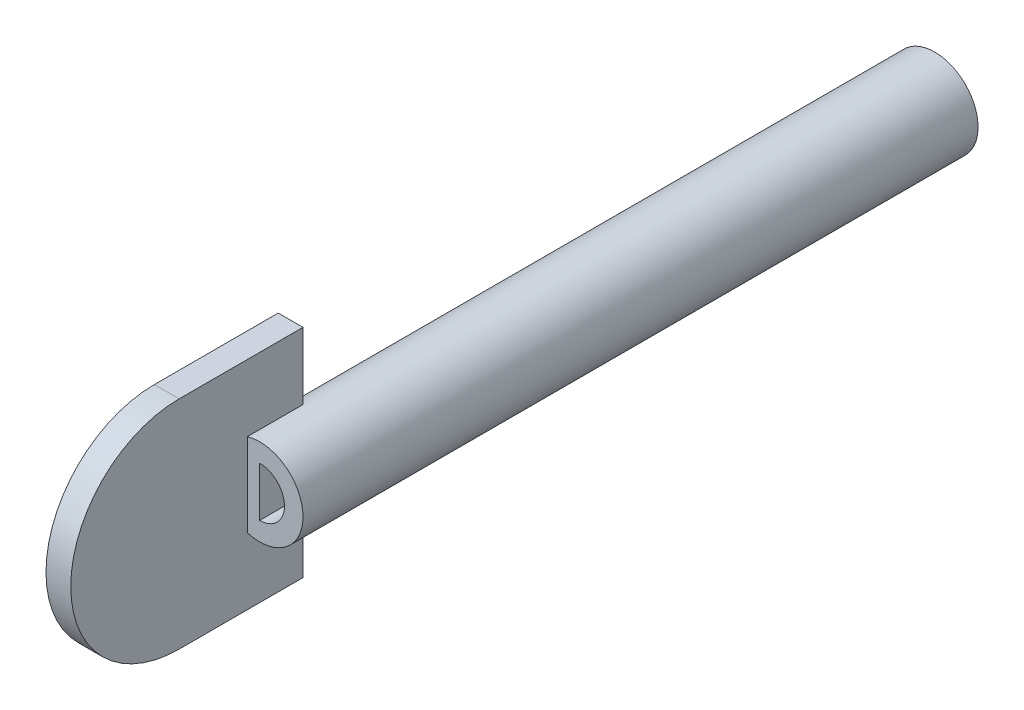
ISO-10303-21;
HEADER;
FILE_DESCRIPTION(('STEP AP214'),'2;1');
FILE_NAME('part.step','',(''),(''),'','','');
FILE_SCHEMA(('AUTOMOTIVE_DESIGN { 1 0 10303 214 1 1 1 1 }'));
ENDSEC;
DATA;
#1=APPLICATION_CONTEXT('core data for automotive mechanical design processes');
#2=APPLICATION_PROTOCOL_DEFINITION('international standard','automotive_design',2000,#1);
#3=PRODUCT_CONTEXT('',#1,'mechanical');
#4=PRODUCT('Part','Part','',(#3));
#5=PRODUCT_RELATED_PRODUCT_CATEGORY('part','',(#4));
#6=PRODUCT_DEFINITION_FORMATION('','',#4);
#7=PRODUCT_DEFINITION_CONTEXT('part definition',#1,'design');
#8=PRODUCT_DEFINITION('design','',#6,#7);
#9=PRODUCT_DEFINITION_SHAPE('','',#8);
#10=(LENGTH_UNIT() NAMED_UNIT(*) SI_UNIT(.MILLI.,.METRE.));
#11=(NAMED_UNIT(*) PLANE_ANGLE_UNIT() SI_UNIT($,.RADIAN.));
#12=(NAMED_UNIT(*) SI_UNIT($,.STERADIAN.) SOLID_ANGLE_UNIT());
#13=UNCERTAINTY_MEASURE_WITH_UNIT(LENGTH_MEASURE(1.E-05),#10,'distance_accuracy_value','');
#14=(GEOMETRIC_REPRESENTATION_CONTEXT(3) GLOBAL_UNCERTAINTY_ASSIGNED_CONTEXT((#13)) GLOBAL_UNIT_ASSIGNED_CONTEXT((#10,
#11,#12)) REPRESENTATION_CONTEXT('',''));
#15=CARTESIAN_POINT('',(0.,0.,0.));
#16=DIRECTION('',(0.,0.,1.));
#17=DIRECTION('',(1.,0.,0.));
#18=AXIS2_PLACEMENT_3D('',#15,#16,#17);
#19=CARTESIAN_POINT('',(4.,17.5,-20.));
#20=DIRECTION('',(0.,0.,1.));
#21=DIRECTION('',(1.,0.,0.));
#22=AXIS2_PLACEMENT_3D('',#19,#20,#21);
#23=PLANE('',#22);
#24=DIRECTION('',(0.,1.,0.));
#25=VECTOR('',#24,1.);
#26=CARTESIAN_POINT('',(4.,17.5,-20.));
#27=LINE('',#26,#25);
#28=CARTESIAN_POINT('',(4.,6.70820393249937,-20.));
#29=VERTEX_POINT('',#28);
#30=CARTESIAN_POINT('',(4.,17.5,-20.));
#31=VERTEX_POINT('',#30);
#32=EDGE_CURVE('E175',#29,#31,#27,.T.);
#33=ORIENTED_EDGE('',*,*,#32,.F.);
#34=CARTESIAN_POINT('',(6.,0.,-20.));
#35=DIRECTION('',(0.,0.,1.));
#36=DIRECTION('',(1.,0.,0.));
#37=AXIS2_PLACEMENT_3D('',#34,#35,#36);
#38=CIRCLE('',#37,7.);
#39=CARTESIAN_POINT('',(0.,3.60555127546399,-20.));
#40=VERTEX_POINT('',#39);
#41=EDGE_CURVE('E145',#29,#40,#38,.T.);
#42=ORIENTED_EDGE('',*,*,#41,.T.);
#43=DIRECTION('',(0.,1.,0.));
#44=VECTOR('',#43,1.);
#45=CARTESIAN_POINT('',(0.,17.5,-20.));
#46=LINE('',#45,#44);
#47=CARTESIAN_POINT('',(0.,17.5,-20.));
#48=VERTEX_POINT('',#47);
#49=EDGE_CURVE('E168',#40,#48,#46,.T.);
#50=ORIENTED_EDGE('',*,*,#49,.T.);
#51=DIRECTION('',(-1.,0.,0.));
#52=VECTOR('',#51,1.);
#53=CARTESIAN_POINT('',(4.,17.5,-20.));
#54=LINE('',#53,#52);
#55=EDGE_CURVE('E191',#31,#48,#54,.T.);
#56=ORIENTED_EDGE('',*,*,#55,.F.);
#57=EDGE_LOOP('',(#33,#42,#50,#56));
#58=FACE_BOUND('',#57,.T.);
#59=ADVANCED_FACE('F41',(#58),#23,.F.);
#60=CARTESIAN_POINT('',(4.,-17.5,20.));
#61=DIRECTION('',(0.,1.,0.));
#62=DIRECTION('',(0.,0.,1.));
#63=AXIS2_PLACEMENT_3D('',#60,#61,#62);
#64=PLANE('',#63);
#65=DIRECTION('',(-1.,0.,0.));
#66=VECTOR('',#65,1.);
#67=CARTESIAN_POINT('',(4.,-17.5,0.));
#68=LINE('',#67,#66);
#69=CARTESIAN_POINT('',(4.,-17.5,0.));
#70=VERTEX_POINT('',#69);
#71=CARTESIAN_POINT('',(0.,-17.5,0.));
#72=VERTEX_POINT('',#71);
#73=EDGE_CURVE('E158',#70,#72,#68,.T.);
#74=ORIENTED_EDGE('',*,*,#73,.T.);
#75=DIRECTION('',(0.,0.,-1.));
#76=VECTOR('',#75,1.);
#77=CARTESIAN_POINT('',(0.,-17.5,20.));
#78=LINE('',#77,#76);
#79=CARTESIAN_POINT('',(0.,-17.5,-20.));
#80=VERTEX_POINT('',#79);
#81=EDGE_CURVE('E187',#72,#80,#78,.T.);
#82=ORIENTED_EDGE('',*,*,#81,.T.);
#83=DIRECTION('',(-1.,0.,0.));
#84=VECTOR('',#83,1.);
#85=CARTESIAN_POINT('',(4.,-17.5,-20.));
#86=LINE('',#85,#84);
#87=CARTESIAN_POINT('',(4.,-17.5,-20.));
#88=VERTEX_POINT('',#87);
#89=EDGE_CURVE('E180',#88,#80,#86,.T.);
#90=ORIENTED_EDGE('',*,*,#89,.F.);
#91=DIRECTION('',(0.,0.,-1.));
#92=VECTOR('',#91,1.);
#93=CARTESIAN_POINT('',(4.,-17.5,20.));
#94=LINE('',#93,#92);
#95=EDGE_CURVE('E178',#70,#88,#94,.T.);
#96=ORIENTED_EDGE('',*,*,#95,.F.);
#97=EDGE_LOOP('',(#74,#82,#90,#96));
#98=FACE_BOUND('',#97,.T.);
#99=ADVANCED_FACE('F234',(#98),#64,.F.);
#100=CARTESIAN_POINT('',(0.,-3.60555127546399,-20.));
#101=VERTEX_POINT('',#100);
#102=EDGE_CURVE('E181',#80,#101,#46,.T.);
#103=ORIENTED_EDGE('',*,*,#102,.T.);
#104=CARTESIAN_POINT('',(4.,-6.70820393249937,-20.));
#105=VERTEX_POINT('',#104);
#106=EDGE_CURVE('E148',#101,#105,#38,.T.);
#107=ORIENTED_EDGE('',*,*,#106,.T.);
#108=EDGE_CURVE('E171',#88,#105,#27,.T.);
#109=ORIENTED_EDGE('',*,*,#108,.F.);
#110=ORIENTED_EDGE('',*,*,#89,.T.);
#111=EDGE_LOOP('',(#103,#107,#109,#110));
#112=FACE_BOUND('',#111,.T.);
#113=ADVANCED_FACE('F43',(#112),#23,.F.);
#114=CARTESIAN_POINT('',(4.,17.5,20.));
#115=DIRECTION('',(0.,-1.,0.));
#116=DIRECTION('',(0.,0.,-1.));
#117=AXIS2_PLACEMENT_3D('',#114,#115,#116);
#118=PLANE('',#117);
#119=DIRECTION('',(0.,0.,1.));
#120=VECTOR('',#119,1.);
#121=CARTESIAN_POINT('',(0.,17.5,20.));
#122=LINE('',#121,#120);
#123=CARTESIAN_POINT('',(0.,17.5,0.));
#124=VERTEX_POINT('',#123);
#125=EDGE_CURVE('E184',#48,#124,#122,.T.);
#126=ORIENTED_EDGE('',*,*,#125,.T.);
#127=DIRECTION('',(-1.,0.,0.));
#128=VECTOR('',#127,1.);
#129=CARTESIAN_POINT('',(4.,17.5,0.));
#130=LINE('',#129,#128);
#131=CARTESIAN_POINT('',(4.,17.5,0.));
#132=VERTEX_POINT('',#131);
#133=EDGE_CURVE('E160',#132,#124,#130,.T.);
#134=ORIENTED_EDGE('',*,*,#133,.F.);
#135=DIRECTION('',(0.,0.,1.));
#136=VECTOR('',#135,1.);
#137=CARTESIAN_POINT('',(4.,17.5,20.));
#138=LINE('',#137,#136);
#139=EDGE_CURVE('E174',#31,#132,#138,.T.);
#140=ORIENTED_EDGE('',*,*,#139,.F.);
#141=ORIENTED_EDGE('',*,*,#55,.T.);
#142=EDGE_LOOP('',(#126,#134,#140,#141));
#143=FACE_BOUND('',#142,.T.);
#144=ADVANCED_FACE('F243',(#143),#118,.F.);
#145=CARTESIAN_POINT('',(4.,0.,0.));
#146=DIRECTION('',(1.,0.,0.));
#147=DIRECTION('',(0.,0.,-1.));
#148=AXIS2_PLACEMENT_3D('',#145,#146,#147);
#149=PLANE('',#148);
#150=DIRECTION('',(0.,0.,-1.));
#151=VECTOR('',#150,1.);
#152=CARTESIAN_POINT('',(4.,-6.70820393249937,-11.));
#153=LINE('',#152,#151);
#154=CARTESIAN_POINT('',(4.,-6.70820393249937,-11.));
#155=VERTEX_POINT('',#154);
#156=EDGE_CURVE('E151',#155,#105,#153,.T.);
#157=ORIENTED_EDGE('',*,*,#156,.F.);
#158=DIRECTION('',(0.,1.,0.));
#159=VECTOR('',#158,1.);
#160=CARTESIAN_POINT('',(4.,0.,-11.));
#161=LINE('',#160,#159);
#162=CARTESIAN_POINT('',(4.,6.70820393249937,-11.));
#163=VERTEX_POINT('',#162);
#164=EDGE_CURVE('E143',#155,#163,#161,.T.);
#165=ORIENTED_EDGE('',*,*,#164,.T.);
#166=DIRECTION('',(0.,0.,-1.));
#167=VECTOR('',#166,1.);
#168=CARTESIAN_POINT('',(4.,6.70820393249937,-11.));
#169=LINE('',#168,#167);
#170=EDGE_CURVE('E147',#29,#163,#169,.F.);
#171=ORIENTED_EDGE('',*,*,#170,.F.);
#172=ORIENTED_EDGE('',*,*,#32,.T.);
#173=ORIENTED_EDGE('',*,*,#139,.T.);
#174=CARTESIAN_POINT('',(4.,0.,0.));
#175=DIRECTION('',(1.,0.,0.));
#176=DIRECTION('',(0.,0.,-1.));
#177=AXIS2_PLACEMENT_3D('',#174,#175,#176);
#178=CIRCLE('',#177,17.5);
#179=EDGE_CURVE('E155',#132,#70,#178,.T.);
#180=ORIENTED_EDGE('',*,*,#179,.T.);
#181=ORIENTED_EDGE('',*,*,#95,.T.);
#182=ORIENTED_EDGE('',*,*,#108,.T.);
#183=EDGE_LOOP('',(#157,#165,#171,#172,#173,#180,#181,#182));
#184=FACE_BOUND('',#183,.T.);
#185=ADVANCED_FACE('F248',(#184),#149,.T.);
#186=CARTESIAN_POINT('',(0.,0.,0.));
#187=DIRECTION('',(1.,0.,0.));
#188=DIRECTION('',(0.,0.,-1.));
#189=AXIS2_PLACEMENT_3D('',#186,#187,#188);
#190=PLANE('',#189);
#191=CARTESIAN_POINT('',(0.,0.,0.));
#192=DIRECTION('',(-1.,0.,0.));
#193=DIRECTION('',(0.,0.,1.));
#194=AXIS2_PLACEMENT_3D('',#191,#192,#193);
#195=CIRCLE('',#194,10.);
#196=CARTESIAN_POINT('',(0.,0.,10.));
#197=VERTEX_POINT('',#196);
#198=EDGE_CURVE('E162',#197,#197,#195,.T.);
#199=ORIENTED_EDGE('',*,*,#198,.F.);
#200=EDGE_LOOP('',(#199));
#201=FACE_BOUND('',#200,.T.);
#202=DIRECTION('',(0.,1.,0.));
#203=VECTOR('',#202,1.);
#204=CARTESIAN_POINT('',(0.,0.,-11.));
#205=LINE('',#204,#203);
#206=CARTESIAN_POINT('',(0.,-3.60555127546399,-11.));
#207=VERTEX_POINT('',#206);
#208=CARTESIAN_POINT('',(0.,3.60555127546399,-11.));
#209=VERTEX_POINT('',#208);
#210=EDGE_CURVE('E194',#207,#209,#205,.T.);
#211=ORIENTED_EDGE('',*,*,#210,.F.);
#212=DIRECTION('',(0.,0.,-1.));
#213=VECTOR('',#212,1.);
#214=CARTESIAN_POINT('',(0.,-3.60555127546399,-11.));
#215=LINE('',#214,#213);
#216=EDGE_CURVE('E199',#207,#101,#215,.T.);
#217=ORIENTED_EDGE('',*,*,#216,.T.);
#218=ORIENTED_EDGE('',*,*,#102,.F.);
#219=ORIENTED_EDGE('',*,*,#81,.F.);
#220=CARTESIAN_POINT('',(0.,0.,0.));
#221=DIRECTION('',(1.,0.,0.));
#222=DIRECTION('',(0.,0.,-1.));
#223=AXIS2_PLACEMENT_3D('',#220,#221,#222);
#224=CIRCLE('',#223,17.5);
#225=EDGE_CURVE('E154',#124,#72,#224,.T.);
#226=ORIENTED_EDGE('',*,*,#225,.F.);
#227=ORIENTED_EDGE('',*,*,#125,.F.);
#228=ORIENTED_EDGE('',*,*,#49,.F.);
#229=DIRECTION('',(0.,0.,-1.));
#230=VECTOR('',#229,1.);
#231=CARTESIAN_POINT('',(0.,3.60555127546399,-11.));
#232=LINE('',#231,#230);
#233=EDGE_CURVE('E197',#40,#209,#232,.F.);
#234=ORIENTED_EDGE('',*,*,#233,.T.);
#235=EDGE_LOOP('',(#211,#217,#218,#219,#226,#227,#228,#234));
#236=FACE_BOUND('',#235,.T.);
#237=ADVANCED_FACE('F263',(#201,#236),#190,.F.);
#238=CARTESIAN_POINT('',(2.,0.,0.));
#239=DIRECTION('',(-1.,0.,0.));
#240=DIRECTION('',(0.,0.,1.));
#241=AXIS2_PLACEMENT_3D('',#238,#239,#240);
#242=CYLINDRICAL_SURFACE('',#241,10.);
#243=CARTESIAN_POINT('',(2.,0.,0.));
#244=DIRECTION('',(-1.,0.,0.));
#245=DIRECTION('',(0.,0.,1.));
#246=AXIS2_PLACEMENT_3D('',#243,#244,#245);
#247=CIRCLE('',#246,10.);
#248=CARTESIAN_POINT('',(2.,0.,10.));
#249=VERTEX_POINT('',#248);
#250=EDGE_CURVE('E165',#249,#249,#247,.T.);
#251=ORIENTED_EDGE('',*,*,#250,.F.);
#252=EDGE_LOOP('',(#251));
#253=FACE_BOUND('',#252,.T.);
#254=ORIENTED_EDGE('',*,*,#198,.T.);
#255=EDGE_LOOP('',(#254));
#256=FACE_BOUND('',#255,.T.);
#257=ADVANCED_FACE('F277',(#253,#256),#242,.F.);
#258=CARTESIAN_POINT('',(2.,0.,0.));
#259=DIRECTION('',(-1.,0.,0.));
#260=DIRECTION('',(0.,0.,1.));
#261=AXIS2_PLACEMENT_3D('',#258,#259,#260);
#262=PLANE('',#261);
#263=ORIENTED_EDGE('',*,*,#250,.T.);
#264=EDGE_LOOP('',(#263));
#265=FACE_BOUND('',#264,.T.);
#266=ADVANCED_FACE('F273',(#265),#262,.T.);
#267=CARTESIAN_POINT('',(4.,0.,0.));
#268=DIRECTION('',(-1.,0.,0.));
#269=DIRECTION('',(0.,0.,1.));
#270=AXIS2_PLACEMENT_3D('',#267,#268,#269);
#271=CYLINDRICAL_SURFACE('',#270,17.5);
#272=ORIENTED_EDGE('',*,*,#225,.T.);
#273=ORIENTED_EDGE('',*,*,#73,.F.);
#274=ORIENTED_EDGE('',*,*,#179,.F.);
#275=ORIENTED_EDGE('',*,*,#133,.T.);
#276=EDGE_LOOP('',(#272,#273,#274,#275));
#277=FACE_BOUND('',#276,.T.);
#278=ADVANCED_FACE('F229',(#277),#271,.T.);
#279=CARTESIAN_POINT('',(6.,0.,-11.));
#280=DIRECTION('',(0.,0.,-1.));
#281=DIRECTION('',(-1.,0.,0.));
#282=AXIS2_PLACEMENT_3D('',#279,#280,#281);
#283=PLANE('',#282);
#284=CARTESIAN_POINT('',(6.,0.,-11.));
#285=DIRECTION('',(0.,0.,-1.));
#286=DIRECTION('',(-1.,0.,0.));
#287=AXIS2_PLACEMENT_3D('',#284,#285,#286);
#288=CIRCLE('',#287,7.);
#289=EDGE_CURVE('E139',#207,#209,#288,.T.);
#290=ORIENTED_EDGE('',*,*,#289,.F.);
#291=ORIENTED_EDGE('',*,*,#210,.T.);
#292=EDGE_LOOP('',(#290,#291));
#293=FACE_BOUND('',#292,.T.);
#294=ADVANCED_FACE('F221',(#293),#283,.F.);
#295=CARTESIAN_POINT('',(6.,0.,-11.));
#296=DIRECTION('',(0.,0.,-1.));
#297=DIRECTION('',(-1.,0.,0.));
#298=AXIS2_PLACEMENT_3D('',#295,#296,#297);
#299=CYLINDRICAL_SURFACE('',#298,7.);
#300=EDGE_CURVE('E142',#163,#155,#288,.T.);
#301=ORIENTED_EDGE('',*,*,#300,.T.);
#302=ORIENTED_EDGE('',*,*,#156,.T.);
#303=ORIENTED_EDGE('',*,*,#106,.F.);
#304=ORIENTED_EDGE('',*,*,#216,.F.);
#305=ORIENTED_EDGE('',*,*,#289,.T.);
#306=ORIENTED_EDGE('',*,*,#233,.F.);
#307=ORIENTED_EDGE('',*,*,#41,.F.);
#308=ORIENTED_EDGE('',*,*,#170,.T.);
#309=EDGE_LOOP('',(#301,#302,#303,#304,#305,#306,#307,#308));
#310=FACE_BOUND('',#309,.T.);
#311=CARTESIAN_POINT('',(6.,0.,-120.));
#312=DIRECTION('',(0.,0.,-1.));
#313=DIRECTION('',(-1.,0.,0.));
#314=AXIS2_PLACEMENT_3D('',#311,#312,#313);
#315=CIRCLE('',#314,7.);
#316=CARTESIAN_POINT('',(-1.,0.,-120.));
#317=VERTEX_POINT('',#316);
#318=EDGE_CURVE('E134',#317,#317,#315,.T.);
#319=ORIENTED_EDGE('',*,*,#318,.F.);
#320=EDGE_LOOP('',(#319));
#321=FACE_BOUND('',#320,.T.);
#322=ADVANCED_FACE('F219',(#310,#321),#299,.T.);
#323=DIRECTION('',(0.,-1.,0.));
#324=VECTOR('',#323,1.);
#325=CARTESIAN_POINT('',(6.,-4.,-11.));
#326=LINE('',#325,#324);
#327=CARTESIAN_POINT('',(6.,4.,-11.));
#328=VERTEX_POINT('',#327);
#329=CARTESIAN_POINT('',(6.,-4.,-11.));
#330=VERTEX_POINT('',#329);
#331=EDGE_CURVE('E122',#328,#330,#326,.T.);
#332=ORIENTED_EDGE('',*,*,#331,.F.);
#333=CARTESIAN_POINT('',(6.,0.,-11.));
#334=DIRECTION('',(0.,0.,1.));
#335=DIRECTION('',(-1.,0.,0.));
#336=AXIS2_PLACEMENT_3D('',#333,#334,#335);
#337=CIRCLE('',#336,4.);
#338=EDGE_CURVE('E56',#330,#328,#337,.T.);
#339=ORIENTED_EDGE('',*,*,#338,.F.);
#340=EDGE_LOOP('',(#332,#339));
#341=FACE_BOUND('',#340,.T.);
#342=ORIENTED_EDGE('',*,*,#164,.F.);
#343=ORIENTED_EDGE('',*,*,#300,.F.);
#344=EDGE_LOOP('',(#342,#343));
#345=FACE_BOUND('',#344,.T.);
#346=ADVANCED_FACE('F126',(#341,#345),#283,.F.);
#347=CARTESIAN_POINT('',(6.,0.,-120.));
#348=DIRECTION('',(0.,0.,-1.));
#349=DIRECTION('',(-1.,0.,0.));
#350=AXIS2_PLACEMENT_3D('',#347,#348,#349);
#351=PLANE('',#350);
#352=CARTESIAN_POINT('',(6.,0.,-120.));
#353=DIRECTION('',(0.,0.,-1.));
#354=DIRECTION('',(-1.,0.,0.));
#355=AXIS2_PLACEMENT_3D('',#352,#353,#354);
#356=CIRCLE('',#355,6.);
#357=CARTESIAN_POINT('',(0.,0.,-120.));
#358=VERTEX_POINT('',#357);
#359=EDGE_CURVE('E118',#358,#358,#356,.T.);
#360=ORIENTED_EDGE('',*,*,#359,.F.);
#361=EDGE_LOOP('',(#360));
#362=FACE_BOUND('',#361,.T.);
#363=ORIENTED_EDGE('',*,*,#318,.T.);
#364=EDGE_LOOP('',(#363));
#365=FACE_BOUND('',#364,.T.);
#366=ADVANCED_FACE('F210',(#362,#365),#351,.T.);
#367=CARTESIAN_POINT('',(6.,0.,-21.));
#368=DIRECTION('',(0.,0.,-1.));
#369=DIRECTION('',(-1.,0.,0.));
#370=AXIS2_PLACEMENT_3D('',#367,#368,#369);
#371=CYLINDRICAL_SURFACE('',#370,6.);
#372=CARTESIAN_POINT('',(6.,0.,-21.));
#373=DIRECTION('',(0.,0.,-1.));
#374=DIRECTION('',(-1.,0.,0.));
#375=AXIS2_PLACEMENT_3D('',#372,#373,#374);
#376=CIRCLE('',#375,6.);
#377=CARTESIAN_POINT('',(0.,0.,-21.));
#378=VERTEX_POINT('',#377);
#379=EDGE_CURVE('E131',#378,#378,#376,.T.);
#380=ORIENTED_EDGE('',*,*,#379,.F.);
#381=EDGE_LOOP('',(#380));
#382=FACE_BOUND('',#381,.T.);
#383=ORIENTED_EDGE('',*,*,#359,.T.);
#384=EDGE_LOOP('',(#383));
#385=FACE_BOUND('',#384,.T.);
#386=ADVANCED_FACE('F204',(#382,#385),#371,.F.);
#387=CARTESIAN_POINT('',(6.,0.,-21.));
#388=DIRECTION('',(0.,0.,-1.));
#389=DIRECTION('',(-1.,0.,0.));
#390=AXIS2_PLACEMENT_3D('',#387,#388,#389);
#391=PLANE('',#390);
#392=CARTESIAN_POINT('',(6.,0.,-21.));
#393=DIRECTION('',(0.,0.,-1.));
#394=DIRECTION('',(-1.,0.,0.));
#395=AXIS2_PLACEMENT_3D('',#392,#393,#394);
#396=CIRCLE('',#395,4.);
#397=CARTESIAN_POINT('',(6.,4.,-21.));
#398=VERTEX_POINT('',#397);
#399=CARTESIAN_POINT('',(6.,-4.,-21.));
#400=VERTEX_POINT('',#399);
#401=EDGE_CURVE('E11',#398,#400,#396,.T.);
#402=ORIENTED_EDGE('',*,*,#401,.F.);
#403=DIRECTION('',(0.,1.,0.));
#404=VECTOR('',#403,1.);
#405=CARTESIAN_POINT('',(6.,0.,-21.));
#406=LINE('',#405,#404);
#407=EDGE_CURVE('E49',#400,#398,#406,.T.);
#408=ORIENTED_EDGE('',*,*,#407,.F.);
#409=EDGE_LOOP('',(#402,#408));
#410=FACE_BOUND('',#409,.T.);
#411=ORIENTED_EDGE('',*,*,#379,.T.);
#412=EDGE_LOOP('',(#411));
#413=FACE_BOUND('',#412,.T.);
#414=ADVANCED_FACE('F201',(#410,#413),#391,.T.);
#415=CARTESIAN_POINT('',(6.,0.,-110.));
#416=DIRECTION('',(0.,0.,1.));
#417=DIRECTION('',(1.,0.,0.));
#418=AXIS2_PLACEMENT_3D('',#415,#416,#417);
#419=CYLINDRICAL_SURFACE('',#418,4.);
#420=ORIENTED_EDGE('',*,*,#401,.T.);
#421=DIRECTION('',(0.,0.,1.));
#422=VECTOR('',#421,1.);
#423=CARTESIAN_POINT('',(6.,-4.,-110.));
#424=LINE('',#423,#422);
#425=EDGE_CURVE('E63',#400,#330,#424,.T.);
#426=ORIENTED_EDGE('',*,*,#425,.T.);
#427=ORIENTED_EDGE('',*,*,#338,.T.);
#428=DIRECTION('',(0.,0.,1.));
#429=VECTOR('',#428,1.);
#430=CARTESIAN_POINT('',(6.,4.,-110.));
#431=LINE('',#430,#429);
#432=EDGE_CURVE('E119',#398,#328,#431,.T.);
#433=ORIENTED_EDGE('',*,*,#432,.F.);
#434=EDGE_LOOP('',(#420,#426,#427,#433));
#435=FACE_BOUND('',#434,.T.);
#436=ADVANCED_FACE('F115',(#435),#419,.F.);
#437=CARTESIAN_POINT('',(6.,-4.,-110.));
#438=DIRECTION('',(-1.,0.,0.));
#439=DIRECTION('',(0.,0.,1.));
#440=AXIS2_PLACEMENT_3D('',#437,#438,#439);
#441=PLANE('',#440);
#442=ORIENTED_EDGE('',*,*,#407,.T.);
#443=ORIENTED_EDGE('',*,*,#432,.T.);
#444=ORIENTED_EDGE('',*,*,#331,.T.);
#445=ORIENTED_EDGE('',*,*,#425,.F.);
#446=EDGE_LOOP('',(#442,#443,#444,#445));
#447=FACE_BOUND('',#446,.T.);
#448=ADVANCED_FACE('F123',(#447),#441,.F.);
#449=CLOSED_SHELL('',(#59,#99,#113,#144,#185,#237,#257,#266,#278,#294,#322,#346,#366,#386,#414,
#436,#448));
#450=MANIFOLD_SOLID_BREP('B2',#449);
#451=ADVANCED_BREP_SHAPE_REPRESENTATION('',(#18,#450),#14);
#452=SHAPE_DEFINITION_REPRESENTATION(#9,#451);
ENDSEC;
END-ISO-10303-21;
